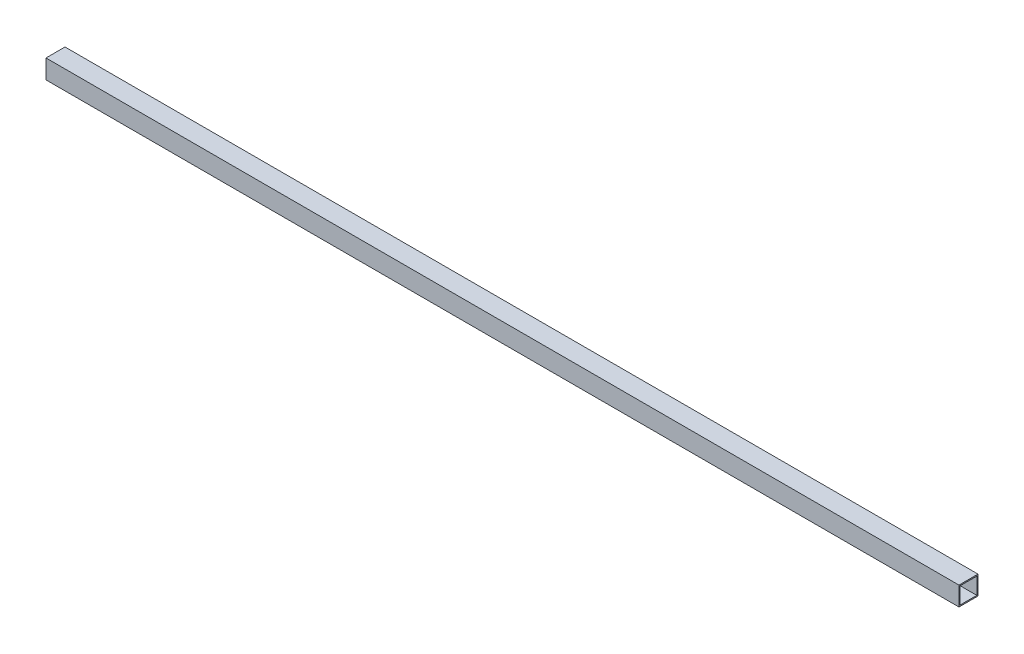
ISO-10303-21;
HEADER;
FILE_DESCRIPTION(('STEP AP214'),'2;1');
FILE_NAME('part.step','',(''),(''),'','','');
FILE_SCHEMA(('AUTOMOTIVE_DESIGN { 1 0 10303 214 1 1 1 1 }'));
ENDSEC;
DATA;
#1=APPLICATION_CONTEXT('core data for automotive mechanical design processes');
#2=APPLICATION_PROTOCOL_DEFINITION('international standard','automotive_design',2000,#1);
#3=PRODUCT_CONTEXT('',#1,'mechanical');
#4=PRODUCT('Part','Part','',(#3));
#5=PRODUCT_RELATED_PRODUCT_CATEGORY('part','',(#4));
#6=PRODUCT_DEFINITION_FORMATION('','',#4);
#7=PRODUCT_DEFINITION_CONTEXT('part definition',#1,'design');
#8=PRODUCT_DEFINITION('design','',#6,#7);
#9=PRODUCT_DEFINITION_SHAPE('','',#8);
#10=(LENGTH_UNIT() NAMED_UNIT(*) SI_UNIT(.MILLI.,.METRE.));
#11=(NAMED_UNIT(*) PLANE_ANGLE_UNIT() SI_UNIT($,.RADIAN.));
#12=(NAMED_UNIT(*) SI_UNIT($,.STERADIAN.) SOLID_ANGLE_UNIT());
#13=UNCERTAINTY_MEASURE_WITH_UNIT(LENGTH_MEASURE(1.E-05),#10,'distance_accuracy_value','');
#14=(GEOMETRIC_REPRESENTATION_CONTEXT(3) GLOBAL_UNCERTAINTY_ASSIGNED_CONTEXT((#13)) GLOBAL_UNIT_ASSIGNED_CONTEXT((#10,
#11,#12)) REPRESENTATION_CONTEXT('',''));
#15=CARTESIAN_POINT('',(0.,0.,0.));
#16=DIRECTION('',(0.,0.,1.));
#17=DIRECTION('',(1.,0.,0.));
#18=AXIS2_PLACEMENT_3D('',#15,#16,#17);
#19=CARTESIAN_POINT('',(1219.2,0.,0.));
#20=DIRECTION('',(-1.,0.,0.));
#21=DIRECTION('',(0.,0.,1.));
#22=AXIS2_PLACEMENT_3D('',#19,#20,#21);
#23=PLANE('',#22);
#24=DIRECTION('',(0.,1.,0.));
#25=VECTOR('',#24,1.);
#26=CARTESIAN_POINT('',(1219.2,-12.7,-12.7));
#27=LINE('',#26,#25);
#28=CARTESIAN_POINT('',(1219.2,-12.7,-12.7));
#29=VERTEX_POINT('',#28);
#30=CARTESIAN_POINT('',(1219.2,12.7,-12.7));
#31=VERTEX_POINT('',#30);
#32=EDGE_CURVE('E135',#29,#31,#27,.T.);
#33=ORIENTED_EDGE('',*,*,#32,.T.);
#34=DIRECTION('',(0.,0.,1.));
#35=VECTOR('',#34,1.);
#36=CARTESIAN_POINT('',(1219.2,12.7,12.7));
#37=LINE('',#36,#35);
#38=CARTESIAN_POINT('',(1219.2,12.7,12.7));
#39=VERTEX_POINT('',#38);
#40=EDGE_CURVE('E138',#31,#39,#37,.T.);
#41=ORIENTED_EDGE('',*,*,#40,.T.);
#42=DIRECTION('',(0.,-1.,0.));
#43=VECTOR('',#42,1.);
#44=CARTESIAN_POINT('',(1219.2,-12.7,12.7));
#45=LINE('',#44,#43);
#46=CARTESIAN_POINT('',(1219.2,-12.7,12.7));
#47=VERTEX_POINT('',#46);
#48=EDGE_CURVE('E141',#39,#47,#45,.T.);
#49=ORIENTED_EDGE('',*,*,#48,.T.);
#50=DIRECTION('',(0.,0.,-1.));
#51=VECTOR('',#50,1.);
#52=CARTESIAN_POINT('',(1219.2,-12.7,12.7));
#53=LINE('',#52,#51);
#54=EDGE_CURVE('E143',#47,#29,#53,.T.);
#55=ORIENTED_EDGE('',*,*,#54,.T.);
#56=EDGE_LOOP('',(#33,#41,#49,#55));
#57=FACE_BOUND('',#56,.T.);
#58=DIRECTION('',(0.,0.,-1.));
#59=VECTOR('',#58,1.);
#60=CARTESIAN_POINT('',(1219.2,-11.1125,11.1125));
#61=LINE('',#60,#59);
#62=CARTESIAN_POINT('',(1219.2,-11.1125,11.1125));
#63=VERTEX_POINT('',#62);
#64=CARTESIAN_POINT('',(1219.2,-11.1125,-11.1125));
#65=VERTEX_POINT('',#64);
#66=EDGE_CURVE('E99',#63,#65,#61,.T.);
#67=ORIENTED_EDGE('',*,*,#66,.F.);
#68=DIRECTION('',(0.,-1.,0.));
#69=VECTOR('',#68,1.);
#70=CARTESIAN_POINT('',(1219.2,-11.1125,11.1125));
#71=LINE('',#70,#69);
#72=CARTESIAN_POINT('',(1219.2,11.1125,11.1125));
#73=VERTEX_POINT('',#72);
#74=EDGE_CURVE('E121',#73,#63,#71,.T.);
#75=ORIENTED_EDGE('',*,*,#74,.F.);
#76=DIRECTION('',(0.,0.,1.));
#77=VECTOR('',#76,1.);
#78=CARTESIAN_POINT('',(1219.2,11.1125,11.1125));
#79=LINE('',#78,#77);
#80=CARTESIAN_POINT('',(1219.2,11.1125,-11.1125));
#81=VERTEX_POINT('',#80);
#82=EDGE_CURVE('E119',#81,#73,#79,.T.);
#83=ORIENTED_EDGE('',*,*,#82,.F.);
#84=DIRECTION('',(0.,1.,0.));
#85=VECTOR('',#84,1.);
#86=CARTESIAN_POINT('',(1219.2,-11.1125,-11.1125));
#87=LINE('',#86,#85);
#88=EDGE_CURVE('E107',#65,#81,#87,.T.);
#89=ORIENTED_EDGE('',*,*,#88,.F.);
#90=EDGE_LOOP('',(#67,#75,#83,#89));
#91=FACE_BOUND('',#90,.T.);
#92=ADVANCED_FACE('F34',(#57,#91),#23,.F.);
#93=CARTESIAN_POINT('',(0.,0.,0.));
#94=DIRECTION('',(-1.,0.,0.));
#95=DIRECTION('',(0.,0.,1.));
#96=AXIS2_PLACEMENT_3D('',#93,#94,#95);
#97=PLANE('',#96);
#98=DIRECTION('',(0.,1.,0.));
#99=VECTOR('',#98,1.);
#100=CARTESIAN_POINT('',(0.,-12.7,-12.7));
#101=LINE('',#100,#99);
#102=CARTESIAN_POINT('',(0.,-12.7,-12.7));
#103=VERTEX_POINT('',#102);
#104=CARTESIAN_POINT('',(0.,12.7,-12.7));
#105=VERTEX_POINT('',#104);
#106=EDGE_CURVE('E115',#103,#105,#101,.T.);
#107=ORIENTED_EDGE('',*,*,#106,.F.);
#108=DIRECTION('',(0.,0.,-1.));
#109=VECTOR('',#108,1.);
#110=CARTESIAN_POINT('',(0.,-12.7,12.7));
#111=LINE('',#110,#109);
#112=CARTESIAN_POINT('',(0.,-12.7,12.7));
#113=VERTEX_POINT('',#112);
#114=EDGE_CURVE('E139',#113,#103,#111,.T.);
#115=ORIENTED_EDGE('',*,*,#114,.F.);
#116=DIRECTION('',(0.,-1.,0.));
#117=VECTOR('',#116,1.);
#118=CARTESIAN_POINT('',(0.,-12.7,12.7));
#119=LINE('',#118,#117);
#120=CARTESIAN_POINT('',(0.,12.7,12.7));
#121=VERTEX_POINT('',#120);
#122=EDGE_CURVE('E150',#121,#113,#119,.T.);
#123=ORIENTED_EDGE('',*,*,#122,.F.);
#124=DIRECTION('',(0.,0.,1.));
#125=VECTOR('',#124,1.);
#126=CARTESIAN_POINT('',(0.,12.7,12.7));
#127=LINE('',#126,#125);
#128=EDGE_CURVE('E148',#105,#121,#127,.T.);
#129=ORIENTED_EDGE('',*,*,#128,.F.);
#130=EDGE_LOOP('',(#107,#115,#123,#129));
#131=FACE_BOUND('',#130,.T.);
#132=DIRECTION('',(0.,-1.,0.));
#133=VECTOR('',#132,1.);
#134=CARTESIAN_POINT('',(0.,-11.1125,11.1125));
#135=LINE('',#134,#133);
#136=CARTESIAN_POINT('',(0.,11.1125,11.1125));
#137=VERTEX_POINT('',#136);
#138=CARTESIAN_POINT('',(0.,-11.1125,11.1125));
#139=VERTEX_POINT('',#138);
#140=EDGE_CURVE('E108',#137,#139,#135,.T.);
#141=ORIENTED_EDGE('',*,*,#140,.T.);
#142=DIRECTION('',(0.,0.,-1.));
#143=VECTOR('',#142,1.);
#144=CARTESIAN_POINT('',(0.,-11.1125,11.1125));
#145=LINE('',#144,#143);
#146=CARTESIAN_POINT('',(0.,-11.1125,-11.1125));
#147=VERTEX_POINT('',#146);
#148=EDGE_CURVE('E57',#139,#147,#145,.T.);
#149=ORIENTED_EDGE('',*,*,#148,.T.);
#150=DIRECTION('',(0.,1.,0.));
#151=VECTOR('',#150,1.);
#152=CARTESIAN_POINT('',(0.,-11.1125,-11.1125));
#153=LINE('',#152,#151);
#154=CARTESIAN_POINT('',(0.,11.1125,-11.1125));
#155=VERTEX_POINT('',#154);
#156=EDGE_CURVE('E114',#147,#155,#153,.T.);
#157=ORIENTED_EDGE('',*,*,#156,.T.);
#158=DIRECTION('',(0.,0.,1.));
#159=VECTOR('',#158,1.);
#160=CARTESIAN_POINT('',(0.,11.1125,11.1125));
#161=LINE('',#160,#159);
#162=EDGE_CURVE('E127',#155,#137,#161,.T.);
#163=ORIENTED_EDGE('',*,*,#162,.T.);
#164=EDGE_LOOP('',(#141,#149,#157,#163));
#165=FACE_BOUND('',#164,.T.);
#166=ADVANCED_FACE('F168',(#131,#165),#97,.T.);
#167=CARTESIAN_POINT('',(1219.2,-12.7,-12.7));
#168=DIRECTION('',(0.,0.,1.));
#169=DIRECTION('',(1.,0.,0.));
#170=AXIS2_PLACEMENT_3D('',#167,#168,#169);
#171=PLANE('',#170);
#172=ORIENTED_EDGE('',*,*,#106,.T.);
#173=DIRECTION('',(-1.,0.,0.));
#174=VECTOR('',#173,1.);
#175=CARTESIAN_POINT('',(1219.2,12.7,-12.7));
#176=LINE('',#175,#174);
#177=EDGE_CURVE('E11',#31,#105,#176,.T.);
#178=ORIENTED_EDGE('',*,*,#177,.F.);
#179=ORIENTED_EDGE('',*,*,#32,.F.);
#180=DIRECTION('',(-1.,0.,0.));
#181=VECTOR('',#180,1.);
#182=CARTESIAN_POINT('',(1219.2,-12.7,-12.7));
#183=LINE('',#182,#181);
#184=EDGE_CURVE('E145',#29,#103,#183,.T.);
#185=ORIENTED_EDGE('',*,*,#184,.T.);
#186=EDGE_LOOP('',(#172,#178,#179,#185));
#187=FACE_BOUND('',#186,.T.);
#188=ADVANCED_FACE('F36',(#187),#171,.F.);
#189=CARTESIAN_POINT('',(1219.2,12.7,12.7));
#190=DIRECTION('',(0.,-1.,0.));
#191=DIRECTION('',(0.,0.,-1.));
#192=AXIS2_PLACEMENT_3D('',#189,#190,#191);
#193=PLANE('',#192);
#194=ORIENTED_EDGE('',*,*,#128,.T.);
#195=DIRECTION('',(-1.,0.,0.));
#196=VECTOR('',#195,1.);
#197=CARTESIAN_POINT('',(1219.2,12.7,12.7));
#198=LINE('',#197,#196);
#199=EDGE_CURVE('E42',#39,#121,#198,.T.);
#200=ORIENTED_EDGE('',*,*,#199,.F.);
#201=ORIENTED_EDGE('',*,*,#40,.F.);
#202=ORIENTED_EDGE('',*,*,#177,.T.);
#203=EDGE_LOOP('',(#194,#200,#201,#202));
#204=FACE_BOUND('',#203,.T.);
#205=ADVANCED_FACE('F178',(#204),#193,.F.);
#206=CARTESIAN_POINT('',(1219.2,-12.7,12.7));
#207=DIRECTION('',(0.,0.,-1.));
#208=DIRECTION('',(-1.,0.,0.));
#209=AXIS2_PLACEMENT_3D('',#206,#207,#208);
#210=PLANE('',#209);
#211=ORIENTED_EDGE('',*,*,#122,.T.);
#212=DIRECTION('',(-1.,0.,0.));
#213=VECTOR('',#212,1.);
#214=CARTESIAN_POINT('',(1219.2,-12.7,12.7));
#215=LINE('',#214,#213);
#216=EDGE_CURVE('E155',#47,#113,#215,.T.);
#217=ORIENTED_EDGE('',*,*,#216,.F.);
#218=ORIENTED_EDGE('',*,*,#48,.F.);
#219=ORIENTED_EDGE('',*,*,#199,.T.);
#220=EDGE_LOOP('',(#211,#217,#218,#219));
#221=FACE_BOUND('',#220,.T.);
#222=ADVANCED_FACE('F162',(#221),#210,.F.);
#223=CARTESIAN_POINT('',(1219.2,-12.7,12.7));
#224=DIRECTION('',(0.,1.,0.));
#225=DIRECTION('',(0.,0.,1.));
#226=AXIS2_PLACEMENT_3D('',#223,#224,#225);
#227=PLANE('',#226);
#228=ORIENTED_EDGE('',*,*,#114,.T.);
#229=ORIENTED_EDGE('',*,*,#184,.F.);
#230=ORIENTED_EDGE('',*,*,#54,.F.);
#231=ORIENTED_EDGE('',*,*,#216,.T.);
#232=EDGE_LOOP('',(#228,#229,#230,#231));
#233=FACE_BOUND('',#232,.T.);
#234=ADVANCED_FACE('F172',(#233),#227,.F.);
#235=CARTESIAN_POINT('',(1219.2,-11.1125,11.1125));
#236=DIRECTION('',(0.,1.,0.));
#237=DIRECTION('',(0.,0.,1.));
#238=AXIS2_PLACEMENT_3D('',#235,#236,#237);
#239=PLANE('',#238);
#240=ORIENTED_EDGE('',*,*,#148,.F.);
#241=DIRECTION('',(-1.,0.,0.));
#242=VECTOR('',#241,1.);
#243=CARTESIAN_POINT('',(1219.2,-11.1125,11.1125));
#244=LINE('',#243,#242);
#245=EDGE_CURVE('E103',#63,#139,#244,.T.);
#246=ORIENTED_EDGE('',*,*,#245,.F.);
#247=ORIENTED_EDGE('',*,*,#66,.T.);
#248=DIRECTION('',(-1.,0.,0.));
#249=VECTOR('',#248,1.);
#250=CARTESIAN_POINT('',(1219.2,-11.1125,-11.1125));
#251=LINE('',#250,#249);
#252=EDGE_CURVE('E102',#65,#147,#251,.T.);
#253=ORIENTED_EDGE('',*,*,#252,.T.);
#254=EDGE_LOOP('',(#240,#246,#247,#253));
#255=FACE_BOUND('',#254,.T.);
#256=ADVANCED_FACE('F101',(#255),#239,.T.);
#257=CARTESIAN_POINT('',(1219.2,-11.1125,-11.1125));
#258=DIRECTION('',(0.,0.,1.));
#259=DIRECTION('',(0.,-1.,0.));
#260=AXIS2_PLACEMENT_3D('',#257,#258,#259);
#261=PLANE('',#260);
#262=ORIENTED_EDGE('',*,*,#156,.F.);
#263=ORIENTED_EDGE('',*,*,#252,.F.);
#264=ORIENTED_EDGE('',*,*,#88,.T.);
#265=DIRECTION('',(-1.,0.,0.));
#266=VECTOR('',#265,1.);
#267=CARTESIAN_POINT('',(1219.2,11.1125,-11.1125));
#268=LINE('',#267,#266);
#269=EDGE_CURVE('E116',#81,#155,#268,.T.);
#270=ORIENTED_EDGE('',*,*,#269,.T.);
#271=EDGE_LOOP('',(#262,#263,#264,#270));
#272=FACE_BOUND('',#271,.T.);
#273=ADVANCED_FACE('F111',(#272),#261,.T.);
#274=CARTESIAN_POINT('',(1219.2,11.1125,11.1125));
#275=DIRECTION('',(0.,-1.,0.));
#276=DIRECTION('',(0.,0.,-1.));
#277=AXIS2_PLACEMENT_3D('',#274,#275,#276);
#278=PLANE('',#277);
#279=ORIENTED_EDGE('',*,*,#162,.F.);
#280=ORIENTED_EDGE('',*,*,#269,.F.);
#281=ORIENTED_EDGE('',*,*,#82,.T.);
#282=DIRECTION('',(-1.,0.,0.));
#283=VECTOR('',#282,1.);
#284=CARTESIAN_POINT('',(1219.2,11.1125,11.1125));
#285=LINE('',#284,#283);
#286=EDGE_CURVE('E49',#73,#137,#285,.T.);
#287=ORIENTED_EDGE('',*,*,#286,.T.);
#288=EDGE_LOOP('',(#279,#280,#281,#287));
#289=FACE_BOUND('',#288,.T.);
#290=ADVANCED_FACE('F201',(#289),#278,.T.);
#291=CARTESIAN_POINT('',(1219.2,-11.1125,11.1125));
#292=DIRECTION('',(0.,0.,-1.));
#293=DIRECTION('',(-1.,0.,0.));
#294=AXIS2_PLACEMENT_3D('',#291,#292,#293);
#295=PLANE('',#294);
#296=ORIENTED_EDGE('',*,*,#140,.F.);
#297=ORIENTED_EDGE('',*,*,#286,.F.);
#298=ORIENTED_EDGE('',*,*,#74,.T.);
#299=ORIENTED_EDGE('',*,*,#245,.T.);
#300=EDGE_LOOP('',(#296,#297,#298,#299));
#301=FACE_BOUND('',#300,.T.);
#302=ADVANCED_FACE('F205',(#301),#295,.T.);
#303=CLOSED_SHELL('',(#92,#166,#188,#205,#222,#234,#256,#273,#290,#302));
#304=MANIFOLD_SOLID_BREP('B2',#303);
#305=ADVANCED_BREP_SHAPE_REPRESENTATION('',(#18,#304),#14);
#306=SHAPE_DEFINITION_REPRESENTATION(#9,#305);
ENDSEC;
END-ISO-10303-21;
